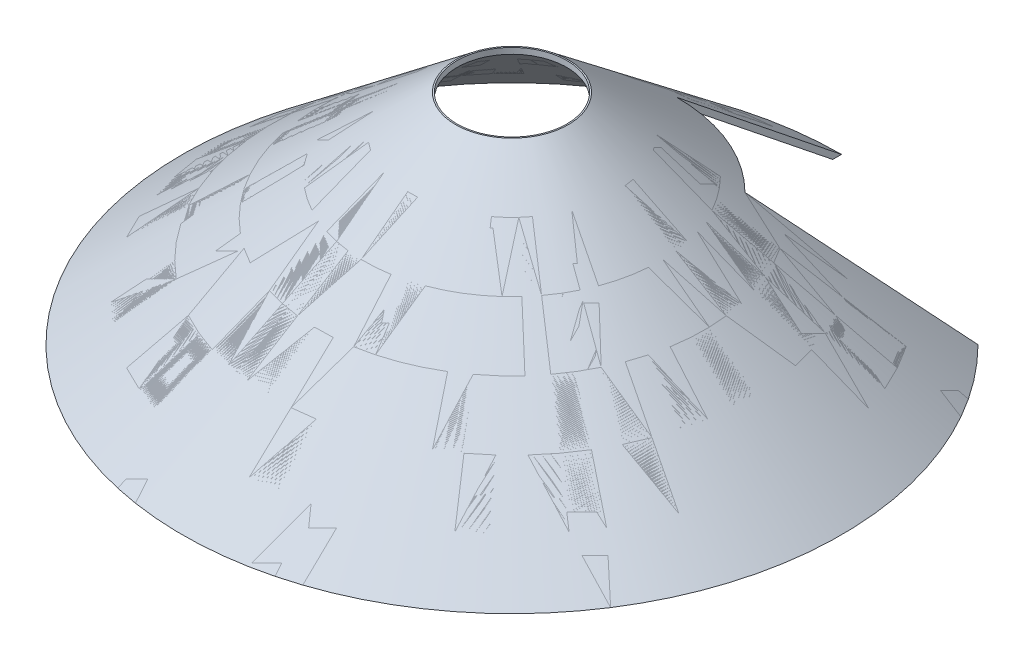
ISO-10303-21;
HEADER;
FILE_DESCRIPTION(('STEP AP214'),'2;1');
FILE_NAME('part.step','',(''),(''),'','','');
FILE_SCHEMA(('AUTOMOTIVE_DESIGN { 1 0 10303 214 1 1 1 1 }'));
ENDSEC;
DATA;
#1=APPLICATION_CONTEXT('core data for automotive mechanical design processes');
#2=APPLICATION_PROTOCOL_DEFINITION('international standard','automotive_design',2000,#1);
#3=PRODUCT_CONTEXT('',#1,'mechanical');
#4=PRODUCT('Part','Part','',(#3));
#5=PRODUCT_RELATED_PRODUCT_CATEGORY('part','',(#4));
#6=PRODUCT_DEFINITION_FORMATION('','',#4);
#7=PRODUCT_DEFINITION_CONTEXT('part definition',#1,'design');
#8=PRODUCT_DEFINITION('design','',#6,#7);
#9=PRODUCT_DEFINITION_SHAPE('','',#8);
#10=(LENGTH_UNIT() NAMED_UNIT(*) SI_UNIT(.MILLI.,.METRE.));
#11=(NAMED_UNIT(*) PLANE_ANGLE_UNIT() SI_UNIT($,.RADIAN.));
#12=(NAMED_UNIT(*) SI_UNIT($,.STERADIAN.) SOLID_ANGLE_UNIT());
#13=UNCERTAINTY_MEASURE_WITH_UNIT(LENGTH_MEASURE(1.E-05),#10,'distance_accuracy_value','');
#14=(GEOMETRIC_REPRESENTATION_CONTEXT(3) GLOBAL_UNCERTAINTY_ASSIGNED_CONTEXT((#13)) GLOBAL_UNIT_ASSIGNED_CONTEXT((#10,
#11,#12)) REPRESENTATION_CONTEXT('',''));
#15=CARTESIAN_POINT('',(0.,0.,0.));
#16=DIRECTION('',(0.,0.,1.));
#17=DIRECTION('',(1.,0.,0.));
#18=AXIS2_PLACEMENT_3D('',#15,#16,#17);
#19=CARTESIAN_POINT('',(0.,-2.63677968348475E-13,0.));
#20=DIRECTION('',(0.,-1.,0.));
#21=DIRECTION('',(1.,0.,0.));
#22=AXIS2_PLACEMENT_3D('',#19,#20,#21);
#23=CONICAL_SURFACE('',#22,76.2,0.89605538457134);
#24=CARTESIAN_POINT('',(0.,-2.63677968348475E-13,0.));
#25=DIRECTION('',(0.,-1.,0.));
#26=DIRECTION('',(1.,0.,0.));
#27=AXIS2_PLACEMENT_3D('',#24,#25,#26);
#28=CIRCLE('',#27,76.2);
#29=CARTESIAN_POINT('',(53.881536726415,0.,-53.8815367264148));
#30=VERTEX_POINT('',#29);
#31=CARTESIAN_POINT('',(-2.66050878019847E-13,-2.63677968348475E-13,-76.2));
#32=VERTEX_POINT('',#31);
#33=EDGE_CURVE('E112',#30,#32,#28,.T.);
#34=ORIENTED_EDGE('',*,*,#33,.F.);
#35=DIRECTION('',(0.552157630374233,-0.624695047554425,-0.552157630374231));
#36=VECTOR('',#35,1.);
#37=CARTESIAN_POINT('',(-1.07350115348062E-13,60.9600000000002,1.05490587067816E-13));
#38=LINE('',#37,#36);
#39=CARTESIAN_POINT('',(26.9407683632075,30.48,-26.9407683632074));
#40=VERTEX_POINT('',#39);
#41=EDGE_CURVE('E13',#30,#40,#38,.F.);
#42=ORIENTED_EDGE('',*,*,#41,.T.);
#43=CARTESIAN_POINT('',(-1.06420351207939E-13,30.48,0.));
#44=DIRECTION('',(0.,-1.,0.));
#45=DIRECTION('',(1.,0.,0.));
#46=AXIS2_PLACEMENT_3D('',#43,#44,#45);
#47=CIRCLE('',#46,38.1);
#48=CARTESIAN_POINT('',(-1.33025439009923E-13,30.48,-38.1));
#49=VERTEX_POINT('',#48);
#50=EDGE_CURVE('E53',#40,#49,#47,.F.);
#51=ORIENTED_EDGE('',*,*,#50,.T.);
#52=DIRECTION('',(0.,0.624695047554427,0.780868809443028));
#53=VECTOR('',#52,1.);
#54=CARTESIAN_POINT('',(0.,60.9600000000002,0.));
#55=LINE('',#54,#53);
#56=EDGE_CURVE('E84',#49,#32,#55,.F.);
#57=ORIENTED_EDGE('',*,*,#56,.T.);
#58=EDGE_LOOP('',(#34,#42,#51,#57));
#59=FACE_BOUND('',#58,.T.);
#60=CARTESIAN_POINT('',(-1.78533471679889E-13,50.5459999999999,0.));
#61=DIRECTION('',(0.,1.,0.));
#62=DIRECTION('',(-1.,0.,0.));
#63=AXIS2_PLACEMENT_3D('',#60,#61,#62);
#64=CIRCLE('',#63,13.0175000000002);
#65=CARTESIAN_POINT('',(-13.0175000000004,50.5459999999999,0.));
#66=VERTEX_POINT('',#65);
#67=EDGE_CURVE('E102',#66,#66,#64,.F.);
#68=ORIENTED_EDGE('',*,*,#67,.T.);
#69=EDGE_LOOP('',(#68));
#70=FACE_BOUND('',#69,.T.);
#71=ADVANCED_FACE('F44',(#59,#70),#23,.T.);
#72=CARTESIAN_POINT('',(3.00267569941428E-13,-86.0000500649728,0.));
#73=DIRECTION('',(0.,-1.,0.));
#74=DIRECTION('',(1.,0.,0.));
#75=AXIS2_PLACEMENT_3D('',#72,#73,#74);
#76=CYLINDRICAL_SURFACE('',#75,12.7000000000002);
#77=CARTESIAN_POINT('',(-1.71688729261767E-13,49.173606443692,0.));
#78=DIRECTION('',(0.,-1.,0.));
#79=DIRECTION('',(1.,0.,0.));
#80=AXIS2_PLACEMENT_3D('',#77,#78,#79);
#81=CIRCLE('',#80,12.7000000000002);
#82=CARTESIAN_POINT('',(12.7,49.173606443692,0.));
#83=VERTEX_POINT('',#82);
#84=EDGE_CURVE('E109',#83,#83,#81,.T.);
#85=ORIENTED_EDGE('',*,*,#84,.T.);
#86=EDGE_LOOP('',(#85));
#87=FACE_BOUND('',#86,.T.);
#88=CARTESIAN_POINT('',(-1.76480415753165E-13,50.5459999999999,0.));
#89=DIRECTION('',(0.,1.,0.));
#90=DIRECTION('',(-1.,0.,0.));
#91=AXIS2_PLACEMENT_3D('',#88,#89,#90);
#92=CIRCLE('',#91,12.7000000000002);
#93=CARTESIAN_POINT('',(-12.7000000000004,50.5459999999999,0.));
#94=VERTEX_POINT('',#93);
#95=EDGE_CURVE('E48',#94,#94,#92,.T.);
#96=ORIENTED_EDGE('',*,*,#95,.T.);
#97=EDGE_LOOP('',(#96));
#98=FACE_BOUND('',#97,.T.);
#99=ADVANCED_FACE('F127',(#87,#98),#76,.F.);
#100=CARTESIAN_POINT('',(74.1670080546155,0.,0.));
#101=DIRECTION('',(0.,-1.,0.));
#102=DIRECTION('',(1.,0.,0.));
#103=AXIS2_PLACEMENT_3D('',#100,#101,#102);
#104=PLANE('',#103);
#105=CARTESIAN_POINT('',(0.,-2.4980018054066E-13,0.));
#106=DIRECTION('',(0.,-1.,0.));
#107=DIRECTION('',(1.,0.,0.));
#108=AXIS2_PLACEMENT_3D('',#105,#106,#107);
#109=CIRCLE('',#108,74.1670080546155);
#110=CARTESIAN_POINT('',(52.443994335736,0.,-52.4439943357358));
#111=VERTEX_POINT('',#110);
#112=CARTESIAN_POINT('',(-2.58952724580519E-13,-2.49800180540661E-13,-74.1670080546155));
#113=VERTEX_POINT('',#112);
#114=EDGE_CURVE('E93',#111,#113,#109,.T.);
#115=ORIENTED_EDGE('',*,*,#114,.F.);
#116=DIRECTION('',(0.707106781186549,0.,-0.707106781186546));
#117=VECTOR('',#116,1.);
#118=CARTESIAN_POINT('',(37.0835040273079,-1.29068101080351E-13,-37.0835040273077));
#119=LINE('',#118,#117);
#120=EDGE_CURVE('E68',#111,#30,#119,.T.);
#121=ORIENTED_EDGE('',*,*,#120,.T.);
#122=ORIENTED_EDGE('',*,*,#33,.T.);
#123=DIRECTION('',(0.,0.,1.));
#124=VECTOR('',#123,1.);
#125=CARTESIAN_POINT('',(0.,-2.5854446337061E-13,2.58952724580518E-13));
#126=LINE('',#125,#124);
#127=EDGE_CURVE('E60',#32,#113,#126,.T.);
#128=ORIENTED_EDGE('',*,*,#127,.T.);
#129=EDGE_LOOP('',(#115,#121,#122,#128));
#130=FACE_BOUND('',#129,.T.);
#131=ADVANCED_FACE('F46',(#130),#104,.T.);
#132=CARTESIAN_POINT('',(-1.71688729261767E-13,49.173606443692,0.));
#133=DIRECTION('',(0.,-1.,0.));
#134=DIRECTION('',(1.,0.,0.));
#135=AXIS2_PLACEMENT_3D('',#132,#133,#134);
#136=CONICAL_SURFACE('',#135,12.7000000000002,0.896055384571341);
#137=ORIENTED_EDGE('',*,*,#84,.F.);
#138=EDGE_LOOP('',(#137));
#139=FACE_BOUND('',#138,.T.);
#140=CARTESIAN_POINT('',(-1.00741828456475E-13,28.853606443692,0.));
#141=DIRECTION('',(0.,-1.,0.));
#142=DIRECTION('',(1.,0.,0.));
#143=AXIS2_PLACEMENT_3D('',#140,#141,#142);
#144=CIRCLE('',#143,38.1);
#145=CARTESIAN_POINT('',(-1.33025439009923E-13,28.853606443692,-38.1));
#146=VERTEX_POINT('',#145);
#147=CARTESIAN_POINT('',(26.9407683632075,28.853606443692,-26.9407683632074));
#148=VERTEX_POINT('',#147);
#149=EDGE_CURVE('E100',#146,#148,#144,.T.);
#150=ORIENTED_EDGE('',*,*,#149,.T.);
#151=DIRECTION('',(0.552157630374233,-0.624695047554425,-0.552157630374231));
#152=VECTOR('',#151,1.);
#153=CARTESIAN_POINT('',(-1.04124862063291E-13,59.3336064436922,1.03037317601123E-13));
#154=LINE('',#153,#152);
#155=EDGE_CURVE('E115',#148,#111,#154,.T.);
#156=ORIENTED_EDGE('',*,*,#155,.T.);
#157=ORIENTED_EDGE('',*,*,#114,.T.);
#158=DIRECTION('',(0.,0.624695047554427,0.780868809443028));
#159=VECTOR('',#158,1.);
#160=CARTESIAN_POINT('',(0.,59.3336064436922,0.));
#161=LINE('',#160,#159);
#162=EDGE_CURVE('E118',#113,#146,#161,.T.);
#163=ORIENTED_EDGE('',*,*,#162,.T.);
#164=EDGE_LOOP('',(#150,#156,#157,#163));
#165=FACE_BOUND('',#164,.T.);
#166=ADVANCED_FACE('F147',(#139,#165),#136,.F.);
#167=CARTESIAN_POINT('',(0.,76.2,0.));
#168=DIRECTION('',(0.,-1.,0.));
#169=DIRECTION('',(0.,0.,-1.));
#170=AXIS2_PLACEMENT_3D('',#167,#168,#169);
#171=CYLINDRICAL_SURFACE('',#170,38.1);
#172=DIRECTION('',(0.,-1.,0.));
#173=VECTOR('',#172,1.);
#174=CARTESIAN_POINT('',(-1.33025439009923E-13,76.2,-38.1));
#175=LINE('',#174,#173);
#176=EDGE_CURVE('E87',#49,#146,#175,.T.);
#177=ORIENTED_EDGE('',*,*,#176,.F.);
#178=ORIENTED_EDGE('',*,*,#50,.F.);
#179=DIRECTION('',(0.,-1.,0.));
#180=VECTOR('',#179,1.);
#181=CARTESIAN_POINT('',(26.9407683632075,76.2,-26.9407683632074));
#182=LINE('',#181,#180);
#183=EDGE_CURVE('E101',#40,#148,#182,.T.);
#184=ORIENTED_EDGE('',*,*,#183,.T.);
#185=ORIENTED_EDGE('',*,*,#149,.F.);
#186=EDGE_LOOP('',(#177,#178,#184,#185));
#187=FACE_BOUND('',#186,.T.);
#188=ADVANCED_FACE('F96',(#187),#171,.T.);
#189=CARTESIAN_POINT('',(26.9407683632075,76.2,-26.9407683632074));
#190=DIRECTION('',(-0.707106781186546,0.,-0.707106781186549));
#191=DIRECTION('',(-0.707106781186549,0.,0.707106781186546));
#192=AXIS2_PLACEMENT_3D('',#189,#190,#191);
#193=PLANE('',#192);
#194=ORIENTED_EDGE('',*,*,#183,.F.);
#195=ORIENTED_EDGE('',*,*,#41,.F.);
#196=ORIENTED_EDGE('',*,*,#120,.F.);
#197=ORIENTED_EDGE('',*,*,#155,.F.);
#198=EDGE_LOOP('',(#194,#195,#196,#197));
#199=FACE_BOUND('',#198,.T.);
#200=ADVANCED_FACE('F136',(#199),#193,.T.);
#201=CARTESIAN_POINT('',(-1.33025439009923E-13,76.2,-38.1));
#202=DIRECTION('',(1.,0.,0.));
#203=DIRECTION('',(0.,0.,-1.));
#204=AXIS2_PLACEMENT_3D('',#201,#202,#203);
#205=PLANE('',#204);
#206=ORIENTED_EDGE('',*,*,#127,.F.);
#207=ORIENTED_EDGE('',*,*,#56,.F.);
#208=ORIENTED_EDGE('',*,*,#176,.T.);
#209=ORIENTED_EDGE('',*,*,#162,.F.);
#210=EDGE_LOOP('',(#206,#207,#208,#209));
#211=FACE_BOUND('',#210,.T.);
#212=ADVANCED_FACE('F86',(#211),#205,.T.);
#213=CARTESIAN_POINT('',(-1.83776792467396E-13,50.5459999999999,0.));
#214=DIRECTION('',(0.,1.,0.));
#215=DIRECTION('',(-1.,0.,0.));
#216=AXIS2_PLACEMENT_3D('',#213,#214,#215);
#217=PLANE('',#216);
#218=ORIENTED_EDGE('',*,*,#67,.F.);
#219=EDGE_LOOP('',(#218));
#220=FACE_BOUND('',#219,.T.);
#221=ORIENTED_EDGE('',*,*,#95,.F.);
#222=EDGE_LOOP('',(#221));
#223=FACE_BOUND('',#222,.T.);
#224=ADVANCED_FACE('F129',(#220,#223),#217,.T.);
#225=CLOSED_SHELL('',(#71,#99,#131,#166,#188,#200,#212,#224));
#226=MANIFOLD_SOLID_BREP('B2',#225);
#227=CARTESIAN_POINT('',(-1.77367252013231E-13,50.8000000000001,0.));
#228=DIRECTION('',(0.,-1.,0.));
#229=DIRECTION('',(1.,0.,0.));
#230=AXIS2_PLACEMENT_3D('',#227,#228,#229);
#231=CONICAL_SURFACE('',#230,12.6999999999998,0.896055384571347);
#232=DIRECTION('',(0.552157630374237,-0.62469504755442,-0.552157630374234));
#233=VECTOR('',#232,1.);
#234=CARTESIAN_POINT('',(-1.07350115348061E-13,60.9599999999998,1.05490587067816E-13));
#235=LINE('',#234,#233);
#236=CARTESIAN_POINT('',(26.9407683632075,30.4800000000001,-26.9407683632074));
#237=VERTEX_POINT('',#236);
#238=CARTESIAN_POINT('',(53.881536726415,0.,-53.8815367264148));
#239=VERTEX_POINT('',#238);
#240=EDGE_CURVE('E267',#237,#239,#235,.T.);
#241=ORIENTED_EDGE('',*,*,#240,.F.);
#242=CARTESIAN_POINT('',(-1.06420351207939E-13,30.4800000000001,0.));
#243=DIRECTION('',(0.,-1.,0.));
#244=DIRECTION('',(1.,0.,0.));
#245=AXIS2_PLACEMENT_3D('',#242,#243,#244);
#246=CIRCLE('',#245,38.1);
#247=CARTESIAN_POINT('',(-1.33025439009923E-13,30.4800000000001,-38.1));
#248=VERTEX_POINT('',#247);
#249=EDGE_CURVE('E42',#248,#237,#246,.T.);
#250=ORIENTED_EDGE('',*,*,#249,.F.);
#251=DIRECTION('',(0.,0.624695047554422,0.780868809443032));
#252=VECTOR('',#251,1.);
#253=CARTESIAN_POINT('',(0.,60.9599999999998,0.));
#254=LINE('',#253,#252);
#255=CARTESIAN_POINT('',(-2.66050878019847E-13,2.91433543964104E-13,-76.2));
#256=VERTEX_POINT('',#255);
#257=EDGE_CURVE('E246',#256,#248,#254,.T.);
#258=ORIENTED_EDGE('',*,*,#257,.F.);
#259=CARTESIAN_POINT('',(0.,2.63677968348475E-13,0.));
#260=DIRECTION('',(0.,-1.,0.));
#261=DIRECTION('',(1.,0.,0.));
#262=AXIS2_PLACEMENT_3D('',#259,#260,#261);
#263=CIRCLE('',#262,76.2);
#264=EDGE_CURVE('E268',#239,#256,#263,.T.);
#265=ORIENTED_EDGE('',*,*,#264,.F.);
#266=EDGE_LOOP('',(#241,#250,#258,#265));
#267=FACE_BOUND('',#266,.T.);
#268=CARTESIAN_POINT('',(-1.78533471679889E-13,50.5459999999999,0.));
#269=DIRECTION('',(0.,1.,0.));
#270=DIRECTION('',(-1.,0.,0.));
#271=AXIS2_PLACEMENT_3D('',#268,#269,#270);
#272=CIRCLE('',#271,13.0175);
#273=CARTESIAN_POINT('',(-13.0175000000002,50.5459999999999,0.));
#274=VERTEX_POINT('',#273);
#275=EDGE_CURVE('E263',#274,#274,#272,.T.);
#276=ORIENTED_EDGE('',*,*,#275,.F.);
#277=EDGE_LOOP('',(#276));
#278=FACE_BOUND('',#277,.T.);
#279=ADVANCED_FACE('F207',(#267,#278),#231,.T.);
#280=CARTESIAN_POINT('',(3.00267569941428E-13,-86.0000500649728,0.));
#281=DIRECTION('',(0.,-1.,0.));
#282=DIRECTION('',(1.,0.,0.));
#283=AXIS2_PLACEMENT_3D('',#280,#281,#282);
#284=CYLINDRICAL_SURFACE('',#283,12.6999999999998);
#285=CARTESIAN_POINT('',(-1.71688729261767E-13,49.1736064436921,0.));
#286=DIRECTION('',(0.,-1.,0.));
#287=DIRECTION('',(1.,0.,0.));
#288=AXIS2_PLACEMENT_3D('',#285,#286,#287);
#289=CIRCLE('',#288,12.6999999999998);
#290=CARTESIAN_POINT('',(12.6999999999996,49.1736064436921,0.));
#291=VERTEX_POINT('',#290);
#292=EDGE_CURVE('E279',#291,#291,#289,.T.);
#293=ORIENTED_EDGE('',*,*,#292,.T.);
#294=EDGE_LOOP('',(#293));
#295=FACE_BOUND('',#294,.T.);
#296=CARTESIAN_POINT('',(-1.76480415753165E-13,50.5459999999999,0.));
#297=DIRECTION('',(0.,1.,0.));
#298=DIRECTION('',(-1.,0.,0.));
#299=AXIS2_PLACEMENT_3D('',#296,#297,#298);
#300=CIRCLE('',#299,12.6999999999998);
#301=CARTESIAN_POINT('',(-12.7,50.5459999999999,0.));
#302=VERTEX_POINT('',#301);
#303=EDGE_CURVE('E211',#302,#302,#300,.F.);
#304=ORIENTED_EDGE('',*,*,#303,.F.);
#305=EDGE_LOOP('',(#304));
#306=FACE_BOUND('',#305,.T.);
#307=ADVANCED_FACE('F285',(#295,#306),#284,.F.);
#308=CARTESIAN_POINT('',(0.,1.27000000000024,0.));
#309=DIRECTION('',(0.,-1.,0.));
#310=DIRECTION('',(1.,0.,0.));
#311=AXIS2_PLACEMENT_3D('',#308,#309,#310);
#312=CONICAL_SURFACE('',#311,72.5795080546151,0.896055384571347);
#313=ORIENTED_EDGE('',*,*,#292,.F.);
#314=EDGE_LOOP('',(#313));
#315=FACE_BOUND('',#314,.T.);
#316=DIRECTION('',(0.552157630374237,-0.62469504755442,-0.552157630374234));
#317=VECTOR('',#316,1.);
#318=CARTESIAN_POINT('',(-1.0412486206329E-13,59.3336064436919,1.03037317601123E-13));
#319=LINE('',#318,#317);
#320=CARTESIAN_POINT('',(52.4439943357357,4.46785195906091E-13,-52.4439943357355));
#321=VERTEX_POINT('',#320);
#322=CARTESIAN_POINT('',(26.9407683632075,28.8536064436921,-26.9407683632074));
#323=VERTEX_POINT('',#322);
#324=EDGE_CURVE('E269',#321,#323,#319,.F.);
#325=ORIENTED_EDGE('',*,*,#324,.F.);
#326=CARTESIAN_POINT('',(0.,2.63677968348475E-13,0.));
#327=DIRECTION('',(0.,-1.,0.));
#328=DIRECTION('',(1.,0.,0.));
#329=AXIS2_PLACEMENT_3D('',#326,#327,#328);
#330=CIRCLE('',#329,74.1670080546151);
#331=CARTESIAN_POINT('',(-2.58952724580516E-13,2.63677968348474E-13,-74.1670080546151));
#332=VERTEX_POINT('',#331);
#333=EDGE_CURVE('E275',#321,#332,#330,.T.);
#334=ORIENTED_EDGE('',*,*,#333,.T.);
#335=DIRECTION('',(0.,0.624695047554422,0.780868809443032));
#336=VECTOR('',#335,1.);
#337=CARTESIAN_POINT('',(0.,59.3336064436919,0.));
#338=LINE('',#337,#336);
#339=CARTESIAN_POINT('',(-1.33025439009923E-13,28.8536064436921,-38.1));
#340=VERTEX_POINT('',#339);
#341=EDGE_CURVE('E223',#340,#332,#338,.F.);
#342=ORIENTED_EDGE('',*,*,#341,.F.);
#343=CARTESIAN_POINT('',(-1.00741828456475E-13,28.8536064436921,0.));
#344=DIRECTION('',(0.,-1.,0.));
#345=DIRECTION('',(1.,0.,0.));
#346=AXIS2_PLACEMENT_3D('',#343,#344,#345);
#347=CIRCLE('',#346,38.1);
#348=EDGE_CURVE('E262',#323,#340,#347,.F.);
#349=ORIENTED_EDGE('',*,*,#348,.F.);
#350=EDGE_LOOP('',(#325,#334,#342,#349));
#351=FACE_BOUND('',#350,.T.);
#352=ADVANCED_FACE('F209',(#315,#351),#312,.F.);
#353=CARTESIAN_POINT('',(-76.2,0.,0.));
#354=DIRECTION('',(0.,1.,0.));
#355=DIRECTION('',(-1.,0.,0.));
#356=AXIS2_PLACEMENT_3D('',#353,#354,#355);
#357=PLANE('',#356);
#358=DIRECTION('',(-0.707106781186549,0.,0.707106781186546));
#359=VECTOR('',#358,1.);
#360=CARTESIAN_POINT('',(-38.1000000000002,1.30560564462743E-13,38.1));
#361=LINE('',#360,#359);
#362=EDGE_CURVE('E216',#239,#321,#361,.T.);
#363=ORIENTED_EDGE('',*,*,#362,.F.);
#364=ORIENTED_EDGE('',*,*,#264,.T.);
#365=DIRECTION('',(0.,0.,-1.));
#366=VECTOR('',#365,1.);
#367=CARTESIAN_POINT('',(0.,2.63586003472667E-13,-2.66050878019847E-13));
#368=LINE('',#367,#366);
#369=EDGE_CURVE('E250',#332,#256,#368,.T.);
#370=ORIENTED_EDGE('',*,*,#369,.F.);
#371=ORIENTED_EDGE('',*,*,#333,.F.);
#372=EDGE_LOOP('',(#363,#364,#370,#371));
#373=FACE_BOUND('',#372,.T.);
#374=ADVANCED_FACE('F290',(#373),#357,.F.);
#375=CARTESIAN_POINT('',(0.,76.2,0.));
#376=DIRECTION('',(0.,-1.,0.));
#377=DIRECTION('',(0.,0.,-1.));
#378=AXIS2_PLACEMENT_3D('',#375,#376,#377);
#379=CYLINDRICAL_SURFACE('',#378,38.1);
#380=ORIENTED_EDGE('',*,*,#348,.T.);
#381=DIRECTION('',(0.,-1.,0.));
#382=VECTOR('',#381,1.);
#383=CARTESIAN_POINT('',(-1.33025439009923E-13,76.2,-38.1));
#384=LINE('',#383,#382);
#385=EDGE_CURVE('E249',#248,#340,#384,.T.);
#386=ORIENTED_EDGE('',*,*,#385,.F.);
#387=ORIENTED_EDGE('',*,*,#249,.T.);
#388=DIRECTION('',(0.,-1.,0.));
#389=VECTOR('',#388,1.);
#390=CARTESIAN_POINT('',(26.9407683632075,76.2,-26.9407683632074));
#391=LINE('',#390,#389);
#392=EDGE_CURVE('E255',#237,#323,#391,.T.);
#393=ORIENTED_EDGE('',*,*,#392,.T.);
#394=EDGE_LOOP('',(#380,#386,#387,#393));
#395=FACE_BOUND('',#394,.T.);
#396=ADVANCED_FACE('F258',(#395),#379,.T.);
#397=CARTESIAN_POINT('',(26.9407683632075,76.2,-26.9407683632074));
#398=DIRECTION('',(-0.707106781186546,0.,-0.707106781186549));
#399=DIRECTION('',(-0.707106781186549,0.,0.707106781186546));
#400=AXIS2_PLACEMENT_3D('',#397,#398,#399);
#401=PLANE('',#400);
#402=ORIENTED_EDGE('',*,*,#324,.T.);
#403=ORIENTED_EDGE('',*,*,#392,.F.);
#404=ORIENTED_EDGE('',*,*,#240,.T.);
#405=ORIENTED_EDGE('',*,*,#362,.T.);
#406=EDGE_LOOP('',(#402,#403,#404,#405));
#407=FACE_BOUND('',#406,.T.);
#408=ADVANCED_FACE('F298',(#407),#401,.T.);
#409=CARTESIAN_POINT('',(-1.33025439009923E-13,76.2,-38.1));
#410=DIRECTION('',(1.,0.,0.));
#411=DIRECTION('',(0.,0.,-1.));
#412=AXIS2_PLACEMENT_3D('',#409,#410,#411);
#413=PLANE('',#412);
#414=ORIENTED_EDGE('',*,*,#341,.T.);
#415=ORIENTED_EDGE('',*,*,#369,.T.);
#416=ORIENTED_EDGE('',*,*,#257,.T.);
#417=ORIENTED_EDGE('',*,*,#385,.T.);
#418=EDGE_LOOP('',(#414,#415,#416,#417));
#419=FACE_BOUND('',#418,.T.);
#420=ADVANCED_FACE('F248',(#419),#413,.T.);
#421=CARTESIAN_POINT('',(-1.83776792467396E-13,50.5459999999999,0.));
#422=DIRECTION('',(0.,1.,0.));
#423=DIRECTION('',(-1.,0.,0.));
#424=AXIS2_PLACEMENT_3D('',#421,#422,#423);
#425=PLANE('',#424);
#426=ORIENTED_EDGE('',*,*,#303,.T.);
#427=EDGE_LOOP('',(#426));
#428=FACE_BOUND('',#427,.T.);
#429=ORIENTED_EDGE('',*,*,#275,.T.);
#430=EDGE_LOOP('',(#429));
#431=FACE_BOUND('',#430,.T.);
#432=ADVANCED_FACE('F339',(#428,#431),#425,.T.);
#433=CLOSED_SHELL('',(#279,#307,#352,#374,#396,#408,#420,#432));
#434=MANIFOLD_SOLID_BREP('B7',#433);
#435=ADVANCED_BREP_SHAPE_REPRESENTATION('',(#18,#226,#434),#14);
#436=SHAPE_DEFINITION_REPRESENTATION(#9,#435);
ENDSEC;
END-ISO-10303-21;
